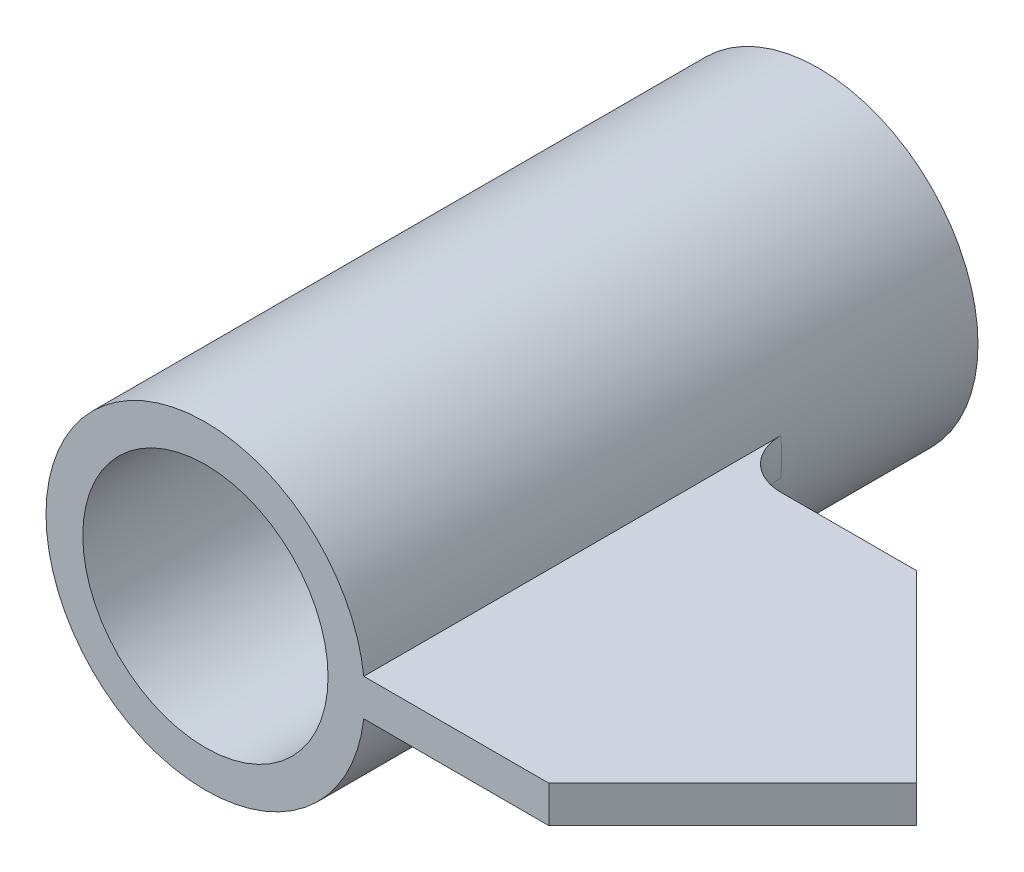
ISO-10303-21;
HEADER;
FILE_DESCRIPTION(('STEP AP214'),'2;1');
FILE_NAME('part.step','',(''),(''),'','','');
FILE_SCHEMA(('AUTOMOTIVE_DESIGN { 1 0 10303 214 1 1 1 1 }'));
ENDSEC;
DATA;
#1=APPLICATION_CONTEXT('core data for automotive mechanical design processes');
#2=APPLICATION_PROTOCOL_DEFINITION('international standard','automotive_design',2000,#1);
#3=PRODUCT_CONTEXT('',#1,'mechanical');
#4=PRODUCT('Part','Part','',(#3));
#5=PRODUCT_RELATED_PRODUCT_CATEGORY('part','',(#4));
#6=PRODUCT_DEFINITION_FORMATION('','',#4);
#7=PRODUCT_DEFINITION_CONTEXT('part definition',#1,'design');
#8=PRODUCT_DEFINITION('design','',#6,#7);
#9=PRODUCT_DEFINITION_SHAPE('','',#8);
#10=(LENGTH_UNIT() NAMED_UNIT(*) SI_UNIT(.MILLI.,.METRE.));
#11=(NAMED_UNIT(*) PLANE_ANGLE_UNIT() SI_UNIT($,.RADIAN.));
#12=(NAMED_UNIT(*) SI_UNIT($,.STERADIAN.) SOLID_ANGLE_UNIT());
#13=UNCERTAINTY_MEASURE_WITH_UNIT(LENGTH_MEASURE(1.E-05),#10,'distance_accuracy_value','');
#14=(GEOMETRIC_REPRESENTATION_CONTEXT(3) GLOBAL_UNCERTAINTY_ASSIGNED_CONTEXT((#13)) GLOBAL_UNIT_ASSIGNED_CONTEXT((#10,
#11,#12)) REPRESENTATION_CONTEXT('',''));
#15=CARTESIAN_POINT('',(0.,0.,0.));
#16=DIRECTION('',(0.,0.,1.));
#17=DIRECTION('',(1.,0.,0.));
#18=AXIS2_PLACEMENT_3D('',#15,#16,#17);
#19=CARTESIAN_POINT('',(0.,0.,55.));
#20=DIRECTION('',(0.,0.,-1.));
#21=DIRECTION('',(-1.,0.,0.));
#22=AXIS2_PLACEMENT_3D('',#19,#20,#21);
#23=CYLINDRICAL_SURFACE('',#22,6.5);
#24=CARTESIAN_POINT('',(0.,0.,63.));
#25=DIRECTION('',(0.,0.,-1.));
#26=DIRECTION('',(-1.,0.,0.));
#27=AXIS2_PLACEMENT_3D('',#24,#25,#26);
#28=CIRCLE('',#27,6.5);
#29=CARTESIAN_POINT('',(6.45659939920817,0.749882789604303,63.));
#30=VERTEX_POINT('',#29);
#31=CARTESIAN_POINT('',(6.45658578507248,-0.750000000000005,63.));
#32=VERTEX_POINT('',#31);
#33=EDGE_CURVE('E127',#30,#32,#28,.T.);
#34=ORIENTED_EDGE('',*,*,#33,.T.);
#35=DIRECTION('',(0.,0.,-1.));
#36=VECTOR('',#35,1.);
#37=CARTESIAN_POINT('',(6.45658578507248,-0.750000000000005,55.));
#38=LINE('',#37,#36);
#39=CARTESIAN_POINT('',(6.45658578507248,-0.750000000000005,80.));
#40=VERTEX_POINT('',#39);
#41=EDGE_CURVE('E111',#32,#40,#38,.F.);
#42=ORIENTED_EDGE('',*,*,#41,.T.);
#43=CARTESIAN_POINT('',(0.,0.,80.));
#44=DIRECTION('',(0.,0.,1.));
#45=DIRECTION('',(1.,0.,0.));
#46=AXIS2_PLACEMENT_3D('',#43,#44,#45);
#47=CIRCLE('',#46,6.5);
#48=CARTESIAN_POINT('',(6.45659939920817,0.749882789604303,80.));
#49=VERTEX_POINT('',#48);
#50=EDGE_CURVE('E125',#49,#40,#47,.T.);
#51=ORIENTED_EDGE('',*,*,#50,.F.);
#52=DIRECTION('',(0.,0.,-1.));
#53=VECTOR('',#52,1.);
#54=CARTESIAN_POINT('',(6.45659939920817,0.749882789604303,55.));
#55=LINE('',#54,#53);
#56=EDGE_CURVE('E129',#49,#30,#55,.T.);
#57=ORIENTED_EDGE('',*,*,#56,.T.);
#58=EDGE_LOOP('',(#34,#42,#51,#57));
#59=FACE_BOUND('',#58,.T.);
#60=CARTESIAN_POINT('',(0.,0.,55.));
#61=DIRECTION('',(0.,0.,-1.));
#62=DIRECTION('',(-1.,0.,0.));
#63=AXIS2_PLACEMENT_3D('',#60,#61,#62);
#64=CIRCLE('',#63,6.5);
#65=CARTESIAN_POINT('',(-6.5,0.,55.));
#66=VERTEX_POINT('',#65);
#67=EDGE_CURVE('E153',#66,#66,#64,.T.);
#68=ORIENTED_EDGE('',*,*,#67,.F.);
#69=EDGE_LOOP('',(#68));
#70=FACE_BOUND('',#69,.T.);
#71=ADVANCED_FACE('F55',(#59,#70),#23,.T.);
#72=CARTESIAN_POINT('',(0.,0.,55.));
#73=DIRECTION('',(0.,0.,-1.));
#74=DIRECTION('',(-1.,0.,0.));
#75=AXIS2_PLACEMENT_3D('',#72,#73,#74);
#76=CYLINDRICAL_SURFACE('',#75,5.);
#77=CARTESIAN_POINT('',(0.,0.,80.));
#78=DIRECTION('',(0.,0.,1.));
#79=DIRECTION('',(1.,0.,0.));
#80=AXIS2_PLACEMENT_3D('',#77,#78,#79);
#81=CIRCLE('',#80,5.);
#82=CARTESIAN_POINT('',(5.,0.,80.));
#83=VERTEX_POINT('',#82);
#84=EDGE_CURVE('E128',#83,#83,#81,.T.);
#85=ORIENTED_EDGE('',*,*,#84,.T.);
#86=EDGE_LOOP('',(#85));
#87=FACE_BOUND('',#86,.T.);
#88=CARTESIAN_POINT('',(0.,0.,55.));
#89=DIRECTION('',(0.,0.,-1.));
#90=DIRECTION('',(-1.,0.,0.));
#91=AXIS2_PLACEMENT_3D('',#88,#89,#90);
#92=CIRCLE('',#91,5.);
#93=CARTESIAN_POINT('',(-5.,0.,55.));
#94=VERTEX_POINT('',#93);
#95=EDGE_CURVE('E60',#94,#94,#92,.T.);
#96=ORIENTED_EDGE('',*,*,#95,.T.);
#97=EDGE_LOOP('',(#96));
#98=FACE_BOUND('',#97,.T.);
#99=ADVANCED_FACE('F174',(#87,#98),#76,.F.);
#100=CARTESIAN_POINT('',(0.,0.,80.));
#101=DIRECTION('',(0.,0.,1.));
#102=DIRECTION('',(1.,0.,0.));
#103=AXIS2_PLACEMENT_3D('',#100,#101,#102);
#104=PLANE('',#103);
#105=DIRECTION('',(1.,0.,0.));
#106=VECTOR('',#105,1.);
#107=CARTESIAN_POINT('',(21.5,-0.750000000000002,80.));
#108=LINE('',#107,#106);
#109=CARTESIAN_POINT('',(14.,-0.750000000000003,80.));
#110=VERTEX_POINT('',#109);
#111=EDGE_CURVE('E108',#40,#110,#108,.T.);
#112=ORIENTED_EDGE('',*,*,#111,.T.);
#113=DIRECTION('',(0.,1.,0.));
#114=VECTOR('',#113,1.);
#115=CARTESIAN_POINT('',(14.,0.,80.));
#116=LINE('',#115,#114);
#117=CARTESIAN_POINT('',(14.,0.749882789604304,80.));
#118=VERTEX_POINT('',#117);
#119=EDGE_CURVE('E135',#110,#118,#116,.T.);
#120=ORIENTED_EDGE('',*,*,#119,.T.);
#121=DIRECTION('',(-1.,0.,0.));
#122=VECTOR('',#121,1.);
#123=CARTESIAN_POINT('',(21.5,0.749882789604305,80.));
#124=LINE('',#123,#122);
#125=EDGE_CURVE('E118',#118,#49,#124,.T.);
#126=ORIENTED_EDGE('',*,*,#125,.T.);
#127=ORIENTED_EDGE('',*,*,#50,.T.);
#128=EDGE_LOOP('',(#112,#120,#126,#127));
#129=FACE_BOUND('',#128,.T.);
#130=ORIENTED_EDGE('',*,*,#84,.F.);
#131=EDGE_LOOP('',(#130));
#132=FACE_BOUND('',#131,.T.);
#133=ADVANCED_FACE('F131',(#129,#132),#104,.T.);
#134=CARTESIAN_POINT('',(21.5,-0.750000000000002,65.));
#135=DIRECTION('',(0.,-1.,0.));
#136=DIRECTION('',(1.,0.,0.));
#137=AXIS2_PLACEMENT_3D('',#134,#135,#136);
#138=PLANE('',#137);
#139=DIRECTION('',(-0.707106781186549,0.,-0.707106781186547));
#140=VECTOR('',#139,1.);
#141=CARTESIAN_POINT('',(17.75,-0.750000000000003,68.75));
#142=LINE('',#141,#140);
#143=CARTESIAN_POINT('',(14.,-0.750000000000003,65.));
#144=VERTEX_POINT('',#143);
#145=CARTESIAN_POINT('',(21.5,-0.750000000000002,72.5));
#146=VERTEX_POINT('',#145);
#147=EDGE_CURVE('E145',#144,#146,#142,.F.);
#148=ORIENTED_EDGE('',*,*,#147,.T.);
#149=DIRECTION('',(0.707106781186547,0.,-0.707106781186549));
#150=VECTOR('',#149,1.);
#151=CARTESIAN_POINT('',(25.25,-0.750000000000001,68.75));
#152=LINE('',#151,#150);
#153=EDGE_CURVE('E113',#146,#110,#152,.F.);
#154=ORIENTED_EDGE('',*,*,#153,.T.);
#155=ORIENTED_EDGE('',*,*,#111,.F.);
#156=ORIENTED_EDGE('',*,*,#41,.F.);
#157=CARTESIAN_POINT('',(6.45658578507248,-0.750000000000005,63.));
#158=CARTESIAN_POINT('',(6.456585895016,-0.750000000000005,63.0560199511624));
#159=CARTESIAN_POINT('',(6.45895679287373,-0.750000000000005,63.1120129419453));
#160=CARTESIAN_POINT('',(6.46841351466681,-0.750000000000005,63.2235956415496));
#161=CARTESIAN_POINT('',(6.47549903271538,-0.750000000000005,63.2791853762978));
#162=CARTESIAN_POINT('',(6.50375284683669,-0.750000000000005,63.4446307390919));
#163=CARTESIAN_POINT('',(6.53191863347822,-0.750000000000005,63.5533739931093));
#164=CARTESIAN_POINT('',(6.60609047779167,-0.750000000000005,63.7645789486701));
#165=CARTESIAN_POINT('',(6.65210361858612,-0.750000000000005,63.8670381375206));
#166=CARTESIAN_POINT('',(6.76061749712723,-0.750000000000005,64.0628165652593));
#167=CARTESIAN_POINT('',(6.82311645382108,-0.750000000000005,64.1561367899872));
#168=CARTESIAN_POINT('',(6.96303625893643,-0.750000000000005,64.3313409786712));
#169=CARTESIAN_POINT('',(7.04050719813571,-0.750000000000005,64.4131849149133));
#170=CARTESIAN_POINT('',(7.20803612323553,-0.750000000000005,64.5628147915133));
#171=CARTESIAN_POINT('',(7.29809675944917,-0.750000000000005,64.6305977643527));
#172=CARTESIAN_POINT('',(7.48881064938792,-0.750000000000005,64.7505779035188));
#173=CARTESIAN_POINT('',(7.58952431661966,-0.750000000000004,64.802678942414));
#174=CARTESIAN_POINT('',(7.79822943150194,-0.750000000000004,64.8892755182759));
#175=CARTESIAN_POINT('',(7.90621692882678,-0.750000000000004,64.9237805255339));
#176=CARTESIAN_POINT('',(8.09015172744773,-0.750000000000004,64.9659511133814));
#177=CARTESIAN_POINT('',(8.16497154279755,-0.750000000000004,64.9787098808429));
#178=CARTESIAN_POINT('',(8.31546626925198,-0.750000000000004,64.9957336912368));
#179=CARTESIAN_POINT('',(8.3911398565467,-0.750000000000004,65.0000104414957));
#180=CARTESIAN_POINT('',(8.46684711093805,-0.750000000000004,65.));
#181=B_SPLINE_CURVE_WITH_KNOTS('',3,(#157,#158,#159,#160,#161,#162,#163,#164,#165,#166,#167,
#168,#169,#170,#171,#172,#173,#174,#175,#176,#177,#178,#179,#180),.UNSPECIFIED.,.F.,.F.,(4,2,2,
2,2,2,2,2,2,2,2,4),(0.,0.167956217268491,0.335901538520614,0.671165884098674,1.00656342321577,
1.34192474233363,1.67842811366767,2.0150024308002,2.3535997320963,2.69201460542254,
2.91926439815595,3.14620030986883),.UNSPECIFIED.);
#182=CARTESIAN_POINT('',(8.46684711093805,-0.750000000000004,65.));
#183=VERTEX_POINT('',#182);
#184=EDGE_CURVE('E65',#32,#183,#181,.T.);
#185=ORIENTED_EDGE('',*,*,#184,.T.);
#186=DIRECTION('',(1.,0.,0.));
#187=VECTOR('',#186,1.);
#188=CARTESIAN_POINT('',(21.5,-0.750000000000002,65.));
#189=LINE('',#188,#187);
#190=EDGE_CURVE('E195',#183,#144,#189,.T.);
#191=ORIENTED_EDGE('',*,*,#190,.T.);
#192=EDGE_LOOP('',(#148,#154,#155,#156,#185,#191));
#193=FACE_BOUND('',#192,.T.);
#194=ADVANCED_FACE('F110',(#193),#138,.T.);
#195=CARTESIAN_POINT('',(21.5,0.749882789604305,65.));
#196=DIRECTION('',(0.,1.,0.));
#197=DIRECTION('',(-1.,0.,0.));
#198=AXIS2_PLACEMENT_3D('',#195,#196,#197);
#199=PLANE('',#198);
#200=ORIENTED_EDGE('',*,*,#125,.F.);
#201=DIRECTION('',(-0.707106781186547,0.,0.707106781186549));
#202=VECTOR('',#201,1.);
#203=CARTESIAN_POINT('',(25.25,0.749882789604306,68.75));
#204=LINE('',#203,#202);
#205=CARTESIAN_POINT('',(21.5,0.749882789604305,72.5));
#206=VERTEX_POINT('',#205);
#207=EDGE_CURVE('E143',#118,#206,#204,.F.);
#208=ORIENTED_EDGE('',*,*,#207,.T.);
#209=DIRECTION('',(0.707106781186549,0.,0.707106781186547));
#210=VECTOR('',#209,1.);
#211=CARTESIAN_POINT('',(17.75,0.749882789604305,68.75));
#212=LINE('',#211,#210);
#213=CARTESIAN_POINT('',(14.,0.749882789604304,65.));
#214=VERTEX_POINT('',#213);
#215=EDGE_CURVE('E137',#206,#214,#212,.F.);
#216=ORIENTED_EDGE('',*,*,#215,.T.);
#217=DIRECTION('',(-1.,0.,0.));
#218=VECTOR('',#217,1.);
#219=CARTESIAN_POINT('',(21.5,0.749882789604305,65.));
#220=LINE('',#219,#218);
#221=CARTESIAN_POINT('',(8.46685749270975,0.749882789604303,65.));
#222=VERTEX_POINT('',#221);
#223=EDGE_CURVE('E197',#214,#222,#220,.T.);
#224=ORIENTED_EDGE('',*,*,#223,.T.);
#225=CARTESIAN_POINT('',(8.46685749270975,0.749882789604303,65.));
#226=CARTESIAN_POINT('',(8.41012616543038,0.749882789604303,64.9999995340136));
#227=CARTESIAN_POINT('',(8.35342214879016,0.749882789604303,64.9976034725925));
#228=CARTESIAN_POINT('',(8.24041999840883,0.749882789604303,64.9880462569389));
#229=CARTESIAN_POINT('',(8.18412184468557,0.749882789604303,64.9808853389404));
#230=CARTESIAN_POINT('',(8.01653170826635,0.749882789604303,64.9523242751285));
#231=CARTESIAN_POINT('',(7.90636214433129,0.749882789604303,64.9238456296738));
#232=CARTESIAN_POINT('',(7.69236958664806,0.749882789604303,64.8488016322939));
#233=CARTESIAN_POINT('',(7.58854962209191,0.749882789604303,64.8022277244036));
#234=CARTESIAN_POINT('',(7.39021225824501,0.749882789604303,64.6923038455143));
#235=CARTESIAN_POINT('',(7.29569316847248,0.749882789604303,64.6289569308491));
#236=CARTESIAN_POINT('',(7.11873744388704,0.749882789604303,64.4873156415015));
#237=CARTESIAN_POINT('',(7.0362912874857,0.749882789604303,64.4090331595364));
#238=CARTESIAN_POINT('',(6.88576169049443,0.749882789604303,64.2396653437029));
#239=CARTESIAN_POINT('',(6.81768087890574,0.749882789604303,64.1485776714307));
#240=CARTESIAN_POINT('',(6.6981557009222,0.749882789604303,63.9566021671673));
#241=CARTESIAN_POINT('',(6.64664432836457,0.749882789604303,63.8557560084287));
#242=CARTESIAN_POINT('',(6.56142925946528,0.749882789604303,63.6468338011364));
#243=CARTESIAN_POINT('',(6.5277134999837,0.749882789604303,63.5387627062934));
#244=CARTESIAN_POINT('',(6.48784285396162,0.749882789604303,63.3583068804657));
#245=CARTESIAN_POINT('',(6.47613406639754,0.749882789604303,63.2871010564251));
#246=CARTESIAN_POINT('',(6.46051345512654,0.749882789604303,63.1439406441085));
#247=CARTESIAN_POINT('',(6.45659071845711,0.749882789604303,63.0719872461285));
#248=CARTESIAN_POINT('',(6.45659939920817,0.749882789604303,63.));
#249=B_SPLINE_CURVE_WITH_KNOTS('',3,(#225,#226,#227,#228,#229,#230,#231,#232,#233,#234,#235,
#236,#237,#238,#239,#240,#241,#242,#243,#244,#245,#246,#247,#248),.UNSPECIFIED.,.F.,.F.,(4,2,2,
2,2,2,2,2,2,2,2,4),(0.,0.170089231919791,0.34017003171935,0.679792855873611,1.01957645936085,
1.35929819091821,1.69875053339453,2.038264945254,2.37638859016255,2.71428273534266,
2.93037488569705,3.14616394588164),.UNSPECIFIED.);
#250=EDGE_CURVE('E14',#222,#30,#249,.T.);
#251=ORIENTED_EDGE('',*,*,#250,.T.);
#252=ORIENTED_EDGE('',*,*,#56,.F.);
#253=EDGE_LOOP('',(#200,#208,#216,#224,#251,#252));
#254=FACE_BOUND('',#253,.T.);
#255=ADVANCED_FACE('F169',(#254),#199,.T.);
#256=CARTESIAN_POINT('',(0.,0.,65.));
#257=DIRECTION('',(0.,0.,-1.));
#258=DIRECTION('',(-1.,0.,0.));
#259=AXIS2_PLACEMENT_3D('',#256,#257,#258);
#260=PLANE('',#259);
#261=ORIENTED_EDGE('',*,*,#190,.F.);
#262=CARTESIAN_POINT('',(0.,0.,65.));
#263=DIRECTION('',(0.,0.,-1.));
#264=DIRECTION('',(-1.,0.,0.));
#265=AXIS2_PLACEMENT_3D('',#262,#263,#264);
#266=CIRCLE('',#265,8.5);
#267=EDGE_CURVE('E78',#183,#222,#266,.F.);
#268=ORIENTED_EDGE('',*,*,#267,.T.);
#269=ORIENTED_EDGE('',*,*,#223,.F.);
#270=DIRECTION('',(0.,-1.,0.));
#271=VECTOR('',#270,1.);
#272=CARTESIAN_POINT('',(14.,0.,65.));
#273=LINE('',#272,#271);
#274=EDGE_CURVE('E148',#214,#144,#273,.T.);
#275=ORIENTED_EDGE('',*,*,#274,.T.);
#276=EDGE_LOOP('',(#261,#268,#269,#275));
#277=FACE_BOUND('',#276,.T.);
#278=ADVANCED_FACE('F185',(#277),#260,.T.);
#279=CARTESIAN_POINT('',(21.5,-0.750000000000002,72.5));
#280=DIRECTION('',(-0.707106781186546,0.,0.707106781186548));
#281=DIRECTION('',(0.,1.,0.));
#282=AXIS2_PLACEMENT_3D('',#279,#280,#281);
#283=PLANE('',#282);
#284=DIRECTION('',(0.,1.,0.));
#285=VECTOR('',#284,1.);
#286=CARTESIAN_POINT('',(21.5,-0.750000000000002,72.5));
#287=LINE('',#286,#285);
#288=EDGE_CURVE('E119',#146,#206,#287,.T.);
#289=ORIENTED_EDGE('',*,*,#288,.F.);
#290=ORIENTED_EDGE('',*,*,#147,.F.);
#291=ORIENTED_EDGE('',*,*,#274,.F.);
#292=ORIENTED_EDGE('',*,*,#215,.F.);
#293=EDGE_LOOP('',(#289,#290,#291,#292));
#294=FACE_BOUND('',#293,.T.);
#295=ADVANCED_FACE('F182',(#294),#283,.F.);
#296=CARTESIAN_POINT('',(14.,0.,80.));
#297=DIRECTION('',(-0.707106781186549,0.,-0.707106781186547));
#298=DIRECTION('',(0.,1.,0.));
#299=AXIS2_PLACEMENT_3D('',#296,#297,#298);
#300=PLANE('',#299);
#301=ORIENTED_EDGE('',*,*,#153,.F.);
#302=ORIENTED_EDGE('',*,*,#288,.T.);
#303=ORIENTED_EDGE('',*,*,#207,.F.);
#304=ORIENTED_EDGE('',*,*,#119,.F.);
#305=EDGE_LOOP('',(#301,#302,#303,#304));
#306=FACE_BOUND('',#305,.T.);
#307=ADVANCED_FACE('F180',(#306),#300,.F.);
#308=CARTESIAN_POINT('',(0.,0.,63.));
#309=DIRECTION('',(0.,0.,-1.));
#310=DIRECTION('',(-1.,0.,0.));
#311=AXIS2_PLACEMENT_3D('',#308,#309,#310);
#312=TOROIDAL_SURFACE('',#311,8.5,2.);
#313=ORIENTED_EDGE('',*,*,#250,.F.);
#314=ORIENTED_EDGE('',*,*,#267,.F.);
#315=ORIENTED_EDGE('',*,*,#184,.F.);
#316=ORIENTED_EDGE('',*,*,#33,.F.);
#317=EDGE_LOOP('',(#313,#314,#315,#316));
#318=FACE_BOUND('',#317,.T.);
#319=ADVANCED_FACE('F57',(#318),#312,.F.);
#320=CARTESIAN_POINT('',(0.,0.,55.));
#321=DIRECTION('',(0.,0.,-1.));
#322=DIRECTION('',(-1.,0.,0.));
#323=AXIS2_PLACEMENT_3D('',#320,#321,#322);
#324=PLANE('',#323);
#325=ORIENTED_EDGE('',*,*,#95,.F.);
#326=EDGE_LOOP('',(#325));
#327=FACE_BOUND('',#326,.T.);
#328=ORIENTED_EDGE('',*,*,#67,.T.);
#329=EDGE_LOOP('',(#328));
#330=FACE_BOUND('',#329,.T.);
#331=ADVANCED_FACE('F210',(#327,#330),#324,.T.);
#332=CLOSED_SHELL('',(#71,#99,#133,#194,#255,#278,#295,#307,#319,#331));
#333=MANIFOLD_SOLID_BREP('B2',#332);
#334=ADVANCED_BREP_SHAPE_REPRESENTATION('',(#18,#333),#14);
#335=SHAPE_DEFINITION_REPRESENTATION(#9,#334);
ENDSEC;
END-ISO-10303-21;
